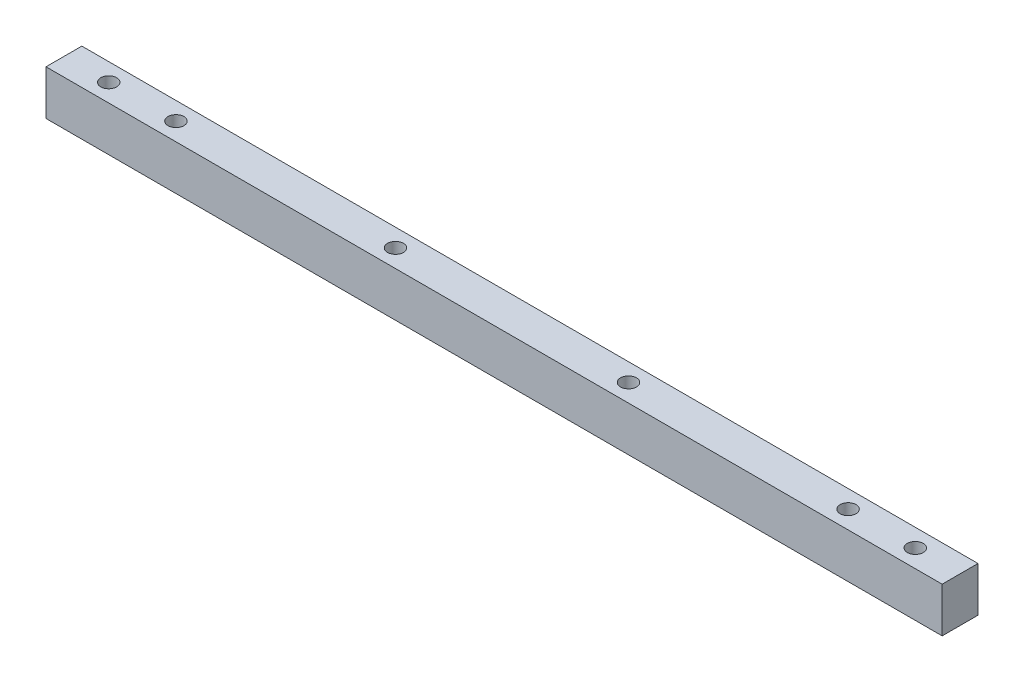
ISO-10303-21;
HEADER;
FILE_DESCRIPTION(('STEP AP214'),'2;1');
FILE_NAME('part.step','',(''),(''),'','','');
FILE_SCHEMA(('AUTOMOTIVE_DESIGN { 1 0 10303 214 1 1 1 1 }'));
ENDSEC;
DATA;
#1=APPLICATION_CONTEXT('core data for automotive mechanical design processes');
#2=APPLICATION_PROTOCOL_DEFINITION('international standard','automotive_design',2000,#1);
#3=PRODUCT_CONTEXT('',#1,'mechanical');
#4=PRODUCT('Part','Part','',(#3));
#5=PRODUCT_RELATED_PRODUCT_CATEGORY('part','',(#4));
#6=PRODUCT_DEFINITION_FORMATION('','',#4);
#7=PRODUCT_DEFINITION_CONTEXT('part definition',#1,'design');
#8=PRODUCT_DEFINITION('design','',#6,#7);
#9=PRODUCT_DEFINITION_SHAPE('','',#8);
#10=(LENGTH_UNIT() NAMED_UNIT(*) SI_UNIT(.MILLI.,.METRE.));
#11=(NAMED_UNIT(*) PLANE_ANGLE_UNIT() SI_UNIT($,.RADIAN.));
#12=(NAMED_UNIT(*) SI_UNIT($,.STERADIAN.) SOLID_ANGLE_UNIT());
#13=UNCERTAINTY_MEASURE_WITH_UNIT(LENGTH_MEASURE(1.E-05),#10,'distance_accuracy_value','');
#14=(GEOMETRIC_REPRESENTATION_CONTEXT(3) GLOBAL_UNCERTAINTY_ASSIGNED_CONTEXT((#13)) GLOBAL_UNIT_ASSIGNED_CONTEXT((#10,
#11,#12)) REPRESENTATION_CONTEXT('',''));
#15=CARTESIAN_POINT('',(0.,0.,0.));
#16=DIRECTION('',(0.,0.,1.));
#17=DIRECTION('',(1.,0.,0.));
#18=AXIS2_PLACEMENT_3D('',#15,#16,#17);
#19=CARTESIAN_POINT('',(-93.505272026962,10.,-4.20373926209361));
#20=DIRECTION('',(1.,0.,0.));
#21=DIRECTION('',(0.,0.,-1.));
#22=AXIS2_PLACEMENT_3D('',#19,#20,#21);
#23=PLANE('',#22);
#24=DIRECTION('',(0.,0.,1.));
#25=VECTOR('',#24,1.);
#26=CARTESIAN_POINT('',(-93.505272026962,0.,-4.20373926209361));
#27=LINE('',#26,#25);
#28=CARTESIAN_POINT('',(-93.505272026962,0.,-4.20373926209361));
#29=VERTEX_POINT('',#28);
#30=CARTESIAN_POINT('',(-93.505272026962,0.,3.79626073790639));
#31=VERTEX_POINT('',#30);
#32=EDGE_CURVE('E96',#29,#31,#27,.T.);
#33=ORIENTED_EDGE('',*,*,#32,.T.);
#34=DIRECTION('',(0.,-1.,0.));
#35=VECTOR('',#34,1.);
#36=CARTESIAN_POINT('',(-93.505272026962,10.,3.79626073790639));
#37=LINE('',#36,#35);
#38=CARTESIAN_POINT('',(-93.505272026962,10.,3.79626073790639));
#39=VERTEX_POINT('',#38);
#40=EDGE_CURVE('E11',#39,#31,#37,.T.);
#41=ORIENTED_EDGE('',*,*,#40,.F.);
#42=DIRECTION('',(0.,0.,1.));
#43=VECTOR('',#42,1.);
#44=CARTESIAN_POINT('',(-93.505272026962,10.,-4.20373926209361));
#45=LINE('',#44,#43);
#46=CARTESIAN_POINT('',(-93.505272026962,10.,-4.20373926209361));
#47=VERTEX_POINT('',#46);
#48=EDGE_CURVE('E84',#47,#39,#45,.T.);
#49=ORIENTED_EDGE('',*,*,#48,.F.);
#50=DIRECTION('',(0.,-1.,0.));
#51=VECTOR('',#50,1.);
#52=CARTESIAN_POINT('',(-93.505272026962,10.,-4.20373926209361));
#53=LINE('',#52,#51);
#54=EDGE_CURVE('E92',#47,#29,#53,.T.);
#55=ORIENTED_EDGE('',*,*,#54,.T.);
#56=EDGE_LOOP('',(#33,#41,#49,#55));
#57=FACE_BOUND('',#56,.T.);
#58=ADVANCED_FACE('F33',(#57),#23,.F.);
#59=CARTESIAN_POINT('',(-93.505272026962,10.,3.79626073790639));
#60=DIRECTION('',(0.,0.,-1.));
#61=DIRECTION('',(-1.,0.,0.));
#62=AXIS2_PLACEMENT_3D('',#59,#60,#61);
#63=PLANE('',#62);
#64=DIRECTION('',(1.,0.,0.));
#65=VECTOR('',#64,1.);
#66=CARTESIAN_POINT('',(-93.505272026962,0.,3.79626073790639));
#67=LINE('',#66,#65);
#68=CARTESIAN_POINT('',(106.494727973038,0.,3.79626073790639));
#69=VERTEX_POINT('',#68);
#70=EDGE_CURVE('E88',#31,#69,#67,.T.);
#71=ORIENTED_EDGE('',*,*,#70,.T.);
#72=DIRECTION('',(0.,-1.,0.));
#73=VECTOR('',#72,1.);
#74=CARTESIAN_POINT('',(106.494727973038,10.,3.79626073790639));
#75=LINE('',#74,#73);
#76=CARTESIAN_POINT('',(106.494727973038,10.,3.79626073790639));
#77=VERTEX_POINT('',#76);
#78=EDGE_CURVE('E41',#77,#69,#75,.T.);
#79=ORIENTED_EDGE('',*,*,#78,.F.);
#80=DIRECTION('',(1.,0.,0.));
#81=VECTOR('',#80,1.);
#82=CARTESIAN_POINT('',(-93.505272026962,10.,3.79626073790639));
#83=LINE('',#82,#81);
#84=EDGE_CURVE('E79',#39,#77,#83,.T.);
#85=ORIENTED_EDGE('',*,*,#84,.F.);
#86=ORIENTED_EDGE('',*,*,#40,.T.);
#87=EDGE_LOOP('',(#71,#79,#85,#86));
#88=FACE_BOUND('',#87,.T.);
#89=ADVANCED_FACE('F87',(#88),#63,.F.);
#90=CARTESIAN_POINT('',(106.494727973038,10.,-4.20373926209361));
#91=DIRECTION('',(-1.,0.,0.));
#92=DIRECTION('',(0.,0.,1.));
#93=AXIS2_PLACEMENT_3D('',#90,#91,#92);
#94=PLANE('',#93);
#95=DIRECTION('',(0.,0.,-1.));
#96=VECTOR('',#95,1.);
#97=CARTESIAN_POINT('',(106.494727973038,0.,-4.20373926209361));
#98=LINE('',#97,#96);
#99=CARTESIAN_POINT('',(106.494727973038,0.,-4.20373926209361));
#100=VERTEX_POINT('',#99);
#101=EDGE_CURVE('E66',#69,#100,#98,.T.);
#102=ORIENTED_EDGE('',*,*,#101,.T.);
#103=DIRECTION('',(0.,-1.,0.));
#104=VECTOR('',#103,1.);
#105=CARTESIAN_POINT('',(106.494727973038,10.,-4.20373926209361));
#106=LINE('',#105,#104);
#107=CARTESIAN_POINT('',(106.494727973038,10.,-4.20373926209361));
#108=VERTEX_POINT('',#107);
#109=EDGE_CURVE('E89',#108,#100,#106,.T.);
#110=ORIENTED_EDGE('',*,*,#109,.F.);
#111=DIRECTION('',(0.,0.,-1.));
#112=VECTOR('',#111,1.);
#113=CARTESIAN_POINT('',(106.494727973038,10.,-4.20373926209361));
#114=LINE('',#113,#112);
#115=EDGE_CURVE('E82',#77,#108,#114,.T.);
#116=ORIENTED_EDGE('',*,*,#115,.F.);
#117=ORIENTED_EDGE('',*,*,#78,.T.);
#118=EDGE_LOOP('',(#102,#110,#116,#117));
#119=FACE_BOUND('',#118,.T.);
#120=ADVANCED_FACE('F90',(#119),#94,.F.);
#121=CARTESIAN_POINT('',(-93.505272026962,10.,-4.20373926209361));
#122=DIRECTION('',(0.,0.,1.));
#123=DIRECTION('',(1.,0.,0.));
#124=AXIS2_PLACEMENT_3D('',#121,#122,#123);
#125=PLANE('',#124);
#126=DIRECTION('',(-1.,0.,0.));
#127=VECTOR('',#126,1.);
#128=CARTESIAN_POINT('',(-93.505272026962,0.,-4.20373926209361));
#129=LINE('',#128,#127);
#130=EDGE_CURVE('E72',#100,#29,#129,.T.);
#131=ORIENTED_EDGE('',*,*,#130,.T.);
#132=ORIENTED_EDGE('',*,*,#54,.F.);
#133=DIRECTION('',(-1.,0.,0.));
#134=VECTOR('',#133,1.);
#135=CARTESIAN_POINT('',(-93.505272026962,10.,-4.20373926209361));
#136=LINE('',#135,#134);
#137=EDGE_CURVE('E49',#108,#47,#136,.T.);
#138=ORIENTED_EDGE('',*,*,#137,.F.);
#139=ORIENTED_EDGE('',*,*,#109,.T.);
#140=EDGE_LOOP('',(#131,#132,#138,#139));
#141=FACE_BOUND('',#140,.T.);
#142=ADVANCED_FACE('F104',(#141),#125,.F.);
#143=CARTESIAN_POINT('',(0.,10.,0.));
#144=DIRECTION('',(0.,1.,0.));
#145=DIRECTION('',(0.,0.,1.));
#146=AXIS2_PLACEMENT_3D('',#143,#144,#145);
#147=PLANE('',#146);
#148=CARTESIAN_POINT('',(96.4947279730381,10.,-0.203739262093608));
#149=DIRECTION('',(0.,1.,0.));
#150=DIRECTION('',(0.,0.,1.));
#151=AXIS2_PLACEMENT_3D('',#148,#149,#150);
#152=CIRCLE('',#151,1.775);
#153=CARTESIAN_POINT('',(96.4947279730381,10.,1.57126073790639));
#154=VERTEX_POINT('',#153);
#155=EDGE_CURVE('E140',#154,#154,#152,.T.);
#156=ORIENTED_EDGE('',*,*,#155,.F.);
#157=EDGE_LOOP('',(#156));
#158=FACE_BOUND('',#157,.T.);
#159=CARTESIAN_POINT('',(81.4947279730381,10.,-0.203739262093607));
#160=DIRECTION('',(0.,1.,0.));
#161=DIRECTION('',(0.,0.,1.));
#162=AXIS2_PLACEMENT_3D('',#159,#160,#161);
#163=CIRCLE('',#162,1.775);
#164=CARTESIAN_POINT('',(81.4947279730381,10.,1.57126073790639));
#165=VERTEX_POINT('',#164);
#166=EDGE_CURVE('E134',#165,#165,#163,.T.);
#167=ORIENTED_EDGE('',*,*,#166,.F.);
#168=EDGE_LOOP('',(#167));
#169=FACE_BOUND('',#168,.T.);
#170=CARTESIAN_POINT('',(-68.505272026962,10.,-0.203739262093584));
#171=DIRECTION('',(0.,1.,0.));
#172=DIRECTION('',(0.,0.,1.));
#173=AXIS2_PLACEMENT_3D('',#170,#171,#172);
#174=CIRCLE('',#173,1.775);
#175=CARTESIAN_POINT('',(-68.505272026962,10.,1.57126073790641));
#176=VERTEX_POINT('',#175);
#177=EDGE_CURVE('E128',#176,#176,#174,.T.);
#178=ORIENTED_EDGE('',*,*,#177,.F.);
#179=EDGE_LOOP('',(#178));
#180=FACE_BOUND('',#179,.T.);
#181=CARTESIAN_POINT('',(-83.505272026962,10.,-0.203739262093584));
#182=DIRECTION('',(0.,1.,0.));
#183=DIRECTION('',(0.,0.,1.));
#184=AXIS2_PLACEMENT_3D('',#181,#182,#183);
#185=CIRCLE('',#184,1.775);
#186=CARTESIAN_POINT('',(-83.505272026962,10.,1.57126073790641));
#187=VERTEX_POINT('',#186);
#188=EDGE_CURVE('E122',#187,#187,#185,.T.);
#189=ORIENTED_EDGE('',*,*,#188,.F.);
#190=EDGE_LOOP('',(#189));
#191=FACE_BOUND('',#190,.T.);
#192=CARTESIAN_POINT('',(32.494727973038,10.,-0.203739262093609));
#193=DIRECTION('',(0.,1.,0.));
#194=DIRECTION('',(0.,0.,1.));
#195=AXIS2_PLACEMENT_3D('',#192,#193,#194);
#196=CIRCLE('',#195,1.775);
#197=CARTESIAN_POINT('',(32.494727973038,10.,1.57126073790639));
#198=VERTEX_POINT('',#197);
#199=EDGE_CURVE('E116',#198,#198,#196,.T.);
#200=ORIENTED_EDGE('',*,*,#199,.F.);
#201=EDGE_LOOP('',(#200));
#202=FACE_BOUND('',#201,.T.);
#203=CARTESIAN_POINT('',(-19.505272026962,10.,-0.203739262093609));
#204=DIRECTION('',(0.,1.,0.));
#205=DIRECTION('',(0.,0.,1.));
#206=AXIS2_PLACEMENT_3D('',#203,#204,#205);
#207=CIRCLE('',#206,1.77499999999999);
#208=CARTESIAN_POINT('',(-19.505272026962,10.,1.57126073790639));
#209=VERTEX_POINT('',#208);
#210=EDGE_CURVE('E110',#209,#209,#207,.T.);
#211=ORIENTED_EDGE('',*,*,#210,.F.);
#212=EDGE_LOOP('',(#211));
#213=FACE_BOUND('',#212,.T.);
#214=ORIENTED_EDGE('',*,*,#48,.T.);
#215=ORIENTED_EDGE('',*,*,#84,.T.);
#216=ORIENTED_EDGE('',*,*,#115,.T.);
#217=ORIENTED_EDGE('',*,*,#137,.T.);
#218=EDGE_LOOP('',(#214,#215,#216,#217));
#219=FACE_BOUND('',#218,.T.);
#220=ADVANCED_FACE('F80',(#158,#169,#180,#191,#202,#213,#219),#147,.T.);
#221=CARTESIAN_POINT('',(0.,0.,0.));
#222=DIRECTION('',(0.,1.,0.));
#223=DIRECTION('',(0.,0.,1.));
#224=AXIS2_PLACEMENT_3D('',#221,#222,#223);
#225=PLANE('',#224);
#226=CARTESIAN_POINT('',(96.4947279730381,0.,-0.203739262093608));
#227=DIRECTION('',(0.,1.,0.));
#228=DIRECTION('',(0.,0.,1.));
#229=AXIS2_PLACEMENT_3D('',#226,#227,#228);
#230=CIRCLE('',#229,1.775);
#231=CARTESIAN_POINT('',(96.4947279730381,0.,1.57126073790639));
#232=VERTEX_POINT('',#231);
#233=EDGE_CURVE('E137',#232,#232,#230,.T.);
#234=ORIENTED_EDGE('',*,*,#233,.T.);
#235=EDGE_LOOP('',(#234));
#236=FACE_BOUND('',#235,.T.);
#237=CARTESIAN_POINT('',(81.4947279730381,0.,-0.203739262093607));
#238=DIRECTION('',(0.,1.,0.));
#239=DIRECTION('',(0.,0.,1.));
#240=AXIS2_PLACEMENT_3D('',#237,#238,#239);
#241=CIRCLE('',#240,1.775);
#242=CARTESIAN_POINT('',(81.4947279730381,0.,1.57126073790639));
#243=VERTEX_POINT('',#242);
#244=EDGE_CURVE('E131',#243,#243,#241,.T.);
#245=ORIENTED_EDGE('',*,*,#244,.T.);
#246=EDGE_LOOP('',(#245));
#247=FACE_BOUND('',#246,.T.);
#248=CARTESIAN_POINT('',(-68.505272026962,0.,-0.203739262093584));
#249=DIRECTION('',(0.,1.,0.));
#250=DIRECTION('',(0.,0.,1.));
#251=AXIS2_PLACEMENT_3D('',#248,#249,#250);
#252=CIRCLE('',#251,1.775);
#253=CARTESIAN_POINT('',(-68.505272026962,0.,1.57126073790641));
#254=VERTEX_POINT('',#253);
#255=EDGE_CURVE('E125',#254,#254,#252,.T.);
#256=ORIENTED_EDGE('',*,*,#255,.T.);
#257=EDGE_LOOP('',(#256));
#258=FACE_BOUND('',#257,.T.);
#259=CARTESIAN_POINT('',(-83.505272026962,0.,-0.203739262093584));
#260=DIRECTION('',(0.,1.,0.));
#261=DIRECTION('',(0.,0.,1.));
#262=AXIS2_PLACEMENT_3D('',#259,#260,#261);
#263=CIRCLE('',#262,1.775);
#264=CARTESIAN_POINT('',(-83.505272026962,0.,1.57126073790641));
#265=VERTEX_POINT('',#264);
#266=EDGE_CURVE('E119',#265,#265,#263,.T.);
#267=ORIENTED_EDGE('',*,*,#266,.T.);
#268=EDGE_LOOP('',(#267));
#269=FACE_BOUND('',#268,.T.);
#270=CARTESIAN_POINT('',(32.494727973038,0.,-0.203739262093609));
#271=DIRECTION('',(0.,1.,0.));
#272=DIRECTION('',(0.,0.,1.));
#273=AXIS2_PLACEMENT_3D('',#270,#271,#272);
#274=CIRCLE('',#273,1.775);
#275=CARTESIAN_POINT('',(32.494727973038,0.,1.57126073790639));
#276=VERTEX_POINT('',#275);
#277=EDGE_CURVE('E113',#276,#276,#274,.T.);
#278=ORIENTED_EDGE('',*,*,#277,.T.);
#279=EDGE_LOOP('',(#278));
#280=FACE_BOUND('',#279,.T.);
#281=CARTESIAN_POINT('',(-19.505272026962,0.,-0.203739262093609));
#282=DIRECTION('',(0.,1.,0.));
#283=DIRECTION('',(0.,0.,1.));
#284=AXIS2_PLACEMENT_3D('',#281,#282,#283);
#285=CIRCLE('',#284,1.77499999999999);
#286=CARTESIAN_POINT('',(-19.505272026962,0.,1.57126073790639));
#287=VERTEX_POINT('',#286);
#288=EDGE_CURVE('E99',#287,#287,#285,.T.);
#289=ORIENTED_EDGE('',*,*,#288,.T.);
#290=EDGE_LOOP('',(#289));
#291=FACE_BOUND('',#290,.T.);
#292=ORIENTED_EDGE('',*,*,#32,.F.);
#293=ORIENTED_EDGE('',*,*,#130,.F.);
#294=ORIENTED_EDGE('',*,*,#101,.F.);
#295=ORIENTED_EDGE('',*,*,#70,.F.);
#296=EDGE_LOOP('',(#292,#293,#294,#295));
#297=FACE_BOUND('',#296,.T.);
#298=ADVANCED_FACE('F107',(#236,#247,#258,#269,#280,#291,#297),#225,.F.);
#299=CARTESIAN_POINT('',(-19.505272026962,0.,-0.203739262093609));
#300=DIRECTION('',(0.,1.,0.));
#301=DIRECTION('',(0.,0.,1.));
#302=AXIS2_PLACEMENT_3D('',#299,#300,#301);
#303=CYLINDRICAL_SURFACE('',#302,1.77499999999999);
#304=ORIENTED_EDGE('',*,*,#288,.F.);
#305=EDGE_LOOP('',(#304));
#306=FACE_BOUND('',#305,.T.);
#307=ORIENTED_EDGE('',*,*,#210,.T.);
#308=EDGE_LOOP('',(#307));
#309=FACE_BOUND('',#308,.T.);
#310=ADVANCED_FACE('F168',(#306,#309),#303,.F.);
#311=CARTESIAN_POINT('',(32.494727973038,0.,-0.203739262093609));
#312=DIRECTION('',(0.,1.,0.));
#313=DIRECTION('',(0.,0.,1.));
#314=AXIS2_PLACEMENT_3D('',#311,#312,#313);
#315=CYLINDRICAL_SURFACE('',#314,1.775);
#316=ORIENTED_EDGE('',*,*,#277,.F.);
#317=EDGE_LOOP('',(#316));
#318=FACE_BOUND('',#317,.T.);
#319=ORIENTED_EDGE('',*,*,#199,.T.);
#320=EDGE_LOOP('',(#319));
#321=FACE_BOUND('',#320,.T.);
#322=ADVANCED_FACE('F170',(#318,#321),#315,.F.);
#323=CARTESIAN_POINT('',(-83.505272026962,0.,-0.203739262093584));
#324=DIRECTION('',(0.,1.,0.));
#325=DIRECTION('',(0.,0.,1.));
#326=AXIS2_PLACEMENT_3D('',#323,#324,#325);
#327=CYLINDRICAL_SURFACE('',#326,1.775);
#328=ORIENTED_EDGE('',*,*,#266,.F.);
#329=EDGE_LOOP('',(#328));
#330=FACE_BOUND('',#329,.T.);
#331=ORIENTED_EDGE('',*,*,#188,.T.);
#332=EDGE_LOOP('',(#331));
#333=FACE_BOUND('',#332,.T.);
#334=ADVANCED_FACE('F177',(#330,#333),#327,.F.);
#335=CARTESIAN_POINT('',(-68.505272026962,0.,-0.203739262093584));
#336=DIRECTION('',(0.,1.,0.));
#337=DIRECTION('',(0.,0.,1.));
#338=AXIS2_PLACEMENT_3D('',#335,#336,#337);
#339=CYLINDRICAL_SURFACE('',#338,1.775);
#340=ORIENTED_EDGE('',*,*,#255,.F.);
#341=EDGE_LOOP('',(#340));
#342=FACE_BOUND('',#341,.T.);
#343=ORIENTED_EDGE('',*,*,#177,.T.);
#344=EDGE_LOOP('',(#343));
#345=FACE_BOUND('',#344,.T.);
#346=ADVANCED_FACE('F215',(#342,#345),#339,.F.);
#347=CARTESIAN_POINT('',(81.4947279730381,0.,-0.203739262093607));
#348=DIRECTION('',(0.,1.,0.));
#349=DIRECTION('',(0.,0.,1.));
#350=AXIS2_PLACEMENT_3D('',#347,#348,#349);
#351=CYLINDRICAL_SURFACE('',#350,1.775);
#352=ORIENTED_EDGE('',*,*,#244,.F.);
#353=EDGE_LOOP('',(#352));
#354=FACE_BOUND('',#353,.T.);
#355=ORIENTED_EDGE('',*,*,#166,.T.);
#356=EDGE_LOOP('',(#355));
#357=FACE_BOUND('',#356,.T.);
#358=ADVANCED_FACE('F151',(#354,#357),#351,.F.);
#359=CARTESIAN_POINT('',(96.4947279730381,0.,-0.203739262093608));
#360=DIRECTION('',(0.,1.,0.));
#361=DIRECTION('',(0.,0.,1.));
#362=AXIS2_PLACEMENT_3D('',#359,#360,#361);
#363=CYLINDRICAL_SURFACE('',#362,1.775);
#364=ORIENTED_EDGE('',*,*,#233,.F.);
#365=EDGE_LOOP('',(#364));
#366=FACE_BOUND('',#365,.T.);
#367=ORIENTED_EDGE('',*,*,#155,.T.);
#368=EDGE_LOOP('',(#367));
#369=FACE_BOUND('',#368,.T.);
#370=ADVANCED_FACE('F148',(#366,#369),#363,.F.);
#371=CLOSED_SHELL('',(#58,#89,#120,#142,#220,#298,#310,#322,#334,#346,#358,#370));
#372=MANIFOLD_SOLID_BREP('B2',#371);
#373=ADVANCED_BREP_SHAPE_REPRESENTATION('',(#18,#372),#14);
#374=SHAPE_DEFINITION_REPRESENTATION(#9,#373);
ENDSEC;
END-ISO-10303-21;
